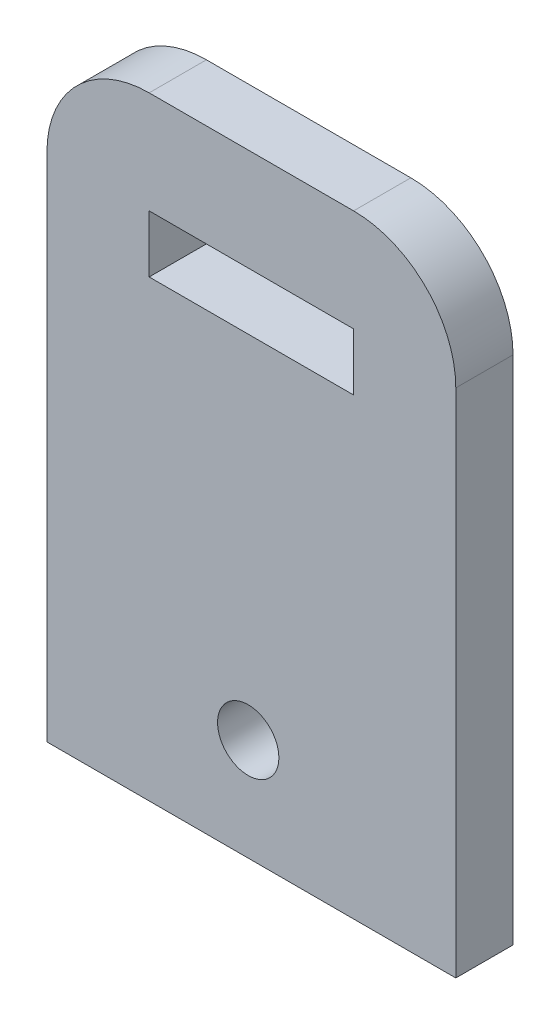
ISO-10303-21;
HEADER;
FILE_DESCRIPTION(('STEP AP214'),'2;1');
FILE_NAME('part.step','',(''),(''),'','','');
FILE_SCHEMA(('AUTOMOTIVE_DESIGN { 1 0 10303 214 1 1 1 1 }'));
ENDSEC;
DATA;
#1=APPLICATION_CONTEXT('core data for automotive mechanical design processes');
#2=APPLICATION_PROTOCOL_DEFINITION('international standard','automotive_design',2000,#1);
#3=PRODUCT_CONTEXT('',#1,'mechanical');
#4=PRODUCT('Part','Part','',(#3));
#5=PRODUCT_RELATED_PRODUCT_CATEGORY('part','',(#4));
#6=PRODUCT_DEFINITION_FORMATION('','',#4);
#7=PRODUCT_DEFINITION_CONTEXT('part definition',#1,'design');
#8=PRODUCT_DEFINITION('design','',#6,#7);
#9=PRODUCT_DEFINITION_SHAPE('','',#8);
#10=(LENGTH_UNIT() NAMED_UNIT(*) SI_UNIT(.MILLI.,.METRE.));
#11=(NAMED_UNIT(*) PLANE_ANGLE_UNIT() SI_UNIT($,.RADIAN.));
#12=(NAMED_UNIT(*) SI_UNIT($,.STERADIAN.) SOLID_ANGLE_UNIT());
#13=UNCERTAINTY_MEASURE_WITH_UNIT(LENGTH_MEASURE(1.E-05),#10,'distance_accuracy_value','');
#14=(GEOMETRIC_REPRESENTATION_CONTEXT(3) GLOBAL_UNCERTAINTY_ASSIGNED_CONTEXT((#13)) GLOBAL_UNIT_ASSIGNED_CONTEXT((#10,
#11,#12)) REPRESENTATION_CONTEXT('',''));
#15=CARTESIAN_POINT('',(0.,0.,0.));
#16=DIRECTION('',(0.,0.,1.));
#17=DIRECTION('',(1.,0.,0.));
#18=AXIS2_PLACEMENT_3D('',#15,#16,#17);
#19=CARTESIAN_POINT('',(96.8820478947637,12.5724817374954,2.8));
#20=DIRECTION('',(0.,0.,1.));
#21=DIRECTION('',(1.,0.,0.));
#22=AXIS2_PLACEMENT_3D('',#19,#20,#21);
#23=PLANE('',#22);
#24=DIRECTION('',(1.,0.,0.));
#25=VECTOR('',#24,1.);
#26=CARTESIAN_POINT('',(96.8820478947637,9.7724817374954,2.8));
#27=LINE('',#26,#25);
#28=CARTESIAN_POINT('',(96.8820478947637,9.7724817374954,2.8));
#29=VERTEX_POINT('',#28);
#30=CARTESIAN_POINT('',(106.882047894764,9.7724817374954,2.8));
#31=VERTEX_POINT('',#30);
#32=EDGE_CURVE('E118',#29,#31,#27,.T.);
#33=ORIENTED_EDGE('',*,*,#32,.F.);
#34=DIRECTION('',(0.,-1.,0.));
#35=VECTOR('',#34,1.);
#36=CARTESIAN_POINT('',(96.8820478947637,12.5724817374954,2.8));
#37=LINE('',#36,#35);
#38=CARTESIAN_POINT('',(96.8820478947637,12.5724817374954,2.8));
#39=VERTEX_POINT('',#38);
#40=EDGE_CURVE('E110',#39,#29,#37,.T.);
#41=ORIENTED_EDGE('',*,*,#40,.F.);
#42=DIRECTION('',(-1.,0.,0.));
#43=VECTOR('',#42,1.);
#44=CARTESIAN_POINT('',(106.882047894764,12.5724817374954,2.8));
#45=LINE('',#44,#43);
#46=CARTESIAN_POINT('',(106.882047894764,12.5724817374954,2.8));
#47=VERTEX_POINT('',#46);
#48=EDGE_CURVE('E133',#47,#39,#45,.T.);
#49=ORIENTED_EDGE('',*,*,#48,.F.);
#50=DIRECTION('',(0.,1.,0.));
#51=VECTOR('',#50,1.);
#52=CARTESIAN_POINT('',(106.882047894764,9.7724817374954,2.8));
#53=LINE('',#52,#51);
#54=EDGE_CURVE('E131',#31,#47,#53,.T.);
#55=ORIENTED_EDGE('',*,*,#54,.F.);
#56=EDGE_LOOP('',(#33,#41,#49,#55));
#57=FACE_BOUND('',#56,.T.);
#58=CARTESIAN_POINT('',(96.8820478947637,12.5724817374954,2.8));
#59=DIRECTION('',(0.,0.,1.));
#60=DIRECTION('',(1.,0.,0.));
#61=AXIS2_PLACEMENT_3D('',#58,#59,#60);
#62=CIRCLE('',#61,5.);
#63=CARTESIAN_POINT('',(96.8820478947637,17.5724817374954,2.8));
#64=VERTEX_POINT('',#63);
#65=CARTESIAN_POINT('',(91.8820478947637,12.5724817374954,2.8));
#66=VERTEX_POINT('',#65);
#67=EDGE_CURVE('E149',#64,#66,#62,.T.);
#68=ORIENTED_EDGE('',*,*,#67,.T.);
#69=DIRECTION('',(0.,-1.,0.));
#70=VECTOR('',#69,1.);
#71=CARTESIAN_POINT('',(91.8820478947637,12.5724817374954,2.8));
#72=LINE('',#71,#70);
#73=CARTESIAN_POINT('',(91.8820478947637,-12.4275182625046,2.8));
#74=VERTEX_POINT('',#73);
#75=EDGE_CURVE('E152',#66,#74,#72,.T.);
#76=ORIENTED_EDGE('',*,*,#75,.T.);
#77=DIRECTION('',(1.,0.,0.));
#78=VECTOR('',#77,1.);
#79=CARTESIAN_POINT('',(91.8820478947637,-12.4275182625046,2.8));
#80=LINE('',#79,#78);
#81=CARTESIAN_POINT('',(111.882047894764,-12.4275182625046,2.8));
#82=VERTEX_POINT('',#81);
#83=EDGE_CURVE('E155',#74,#82,#80,.T.);
#84=ORIENTED_EDGE('',*,*,#83,.T.);
#85=DIRECTION('',(0.,1.,0.));
#86=VECTOR('',#85,1.);
#87=CARTESIAN_POINT('',(111.882047894764,-12.4275182625046,2.8));
#88=LINE('',#87,#86);
#89=CARTESIAN_POINT('',(111.882047894764,12.5724817374954,2.8));
#90=VERTEX_POINT('',#89);
#91=EDGE_CURVE('E157',#82,#90,#88,.T.);
#92=ORIENTED_EDGE('',*,*,#91,.T.);
#93=CARTESIAN_POINT('',(106.882047894764,12.5724817374954,2.8));
#94=DIRECTION('',(0.,0.,1.));
#95=DIRECTION('',(1.,0.,0.));
#96=AXIS2_PLACEMENT_3D('',#93,#94,#95);
#97=CIRCLE('',#96,5.);
#98=CARTESIAN_POINT('',(106.882047894764,17.5724817374954,2.8));
#99=VERTEX_POINT('',#98);
#100=EDGE_CURVE('E159',#90,#99,#97,.T.);
#101=ORIENTED_EDGE('',*,*,#100,.T.);
#102=DIRECTION('',(-1.,0.,0.));
#103=VECTOR('',#102,1.);
#104=CARTESIAN_POINT('',(106.882047894764,17.5724817374954,2.8));
#105=LINE('',#104,#103);
#106=EDGE_CURVE('E161',#99,#64,#105,.T.);
#107=ORIENTED_EDGE('',*,*,#106,.T.);
#108=EDGE_LOOP('',(#68,#76,#84,#92,#101,#107));
#109=FACE_BOUND('',#108,.T.);
#110=CARTESIAN_POINT('',(101.727306447207,-7.4275182625046,2.8));
#111=DIRECTION('',(0.,0.,1.));
#112=DIRECTION('',(1.,0.,0.));
#113=AXIS2_PLACEMENT_3D('',#110,#111,#112);
#114=CIRCLE('',#113,1.5);
#115=CARTESIAN_POINT('',(103.227306447207,-7.4275182625046,2.8));
#116=VERTEX_POINT('',#115);
#117=EDGE_CURVE('E139',#116,#116,#114,.T.);
#118=ORIENTED_EDGE('',*,*,#117,.F.);
#119=EDGE_LOOP('',(#118));
#120=FACE_BOUND('',#119,.T.);
#121=ADVANCED_FACE('F33',(#57,#109,#120),#23,.T.);
#122=CARTESIAN_POINT('',(96.8820478947637,12.5724817374954,0.));
#123=DIRECTION('',(0.,0.,1.));
#124=DIRECTION('',(1.,0.,0.));
#125=AXIS2_PLACEMENT_3D('',#122,#123,#124);
#126=PLANE('',#125);
#127=CARTESIAN_POINT('',(96.8820478947637,12.5724817374954,0.));
#128=DIRECTION('',(0.,0.,1.));
#129=DIRECTION('',(1.,0.,0.));
#130=AXIS2_PLACEMENT_3D('',#127,#128,#129);
#131=CIRCLE('',#130,5.);
#132=CARTESIAN_POINT('',(96.8820478947637,17.5724817374954,0.));
#133=VERTEX_POINT('',#132);
#134=CARTESIAN_POINT('',(91.8820478947637,12.5724817374954,0.));
#135=VERTEX_POINT('',#134);
#136=EDGE_CURVE('E126',#133,#135,#131,.T.);
#137=ORIENTED_EDGE('',*,*,#136,.F.);
#138=DIRECTION('',(-1.,0.,0.));
#139=VECTOR('',#138,1.);
#140=CARTESIAN_POINT('',(106.882047894764,17.5724817374954,0.));
#141=LINE('',#140,#139);
#142=CARTESIAN_POINT('',(106.882047894764,17.5724817374954,0.));
#143=VERTEX_POINT('',#142);
#144=EDGE_CURVE('E153',#143,#133,#141,.T.);
#145=ORIENTED_EDGE('',*,*,#144,.F.);
#146=CARTESIAN_POINT('',(106.882047894764,12.5724817374954,0.));
#147=DIRECTION('',(0.,0.,1.));
#148=DIRECTION('',(1.,0.,0.));
#149=AXIS2_PLACEMENT_3D('',#146,#147,#148);
#150=CIRCLE('',#149,5.);
#151=CARTESIAN_POINT('',(111.882047894764,12.5724817374954,0.));
#152=VERTEX_POINT('',#151);
#153=EDGE_CURVE('E173',#152,#143,#150,.T.);
#154=ORIENTED_EDGE('',*,*,#153,.F.);
#155=DIRECTION('',(0.,1.,0.));
#156=VECTOR('',#155,1.);
#157=CARTESIAN_POINT('',(111.882047894764,-2.4275182625046,0.));
#158=LINE('',#157,#156);
#159=CARTESIAN_POINT('',(111.882047894764,-12.4275182625046,0.));
#160=VERTEX_POINT('',#159);
#161=EDGE_CURVE('E171',#160,#152,#158,.T.);
#162=ORIENTED_EDGE('',*,*,#161,.F.);
#163=DIRECTION('',(1.,0.,0.));
#164=VECTOR('',#163,1.);
#165=CARTESIAN_POINT('',(91.8820478947637,-12.4275182625046,0.));
#166=LINE('',#165,#164);
#167=CARTESIAN_POINT('',(91.8820478947637,-12.4275182625046,0.));
#168=VERTEX_POINT('',#167);
#169=EDGE_CURVE('E168',#168,#160,#166,.T.);
#170=ORIENTED_EDGE('',*,*,#169,.F.);
#171=DIRECTION('',(0.,-1.,0.));
#172=VECTOR('',#171,1.);
#173=CARTESIAN_POINT('',(91.8820478947637,-12.4275182625046,0.));
#174=LINE('',#173,#172);
#175=EDGE_CURVE('E166',#135,#168,#174,.T.);
#176=ORIENTED_EDGE('',*,*,#175,.F.);
#177=EDGE_LOOP('',(#137,#145,#154,#162,#170,#176));
#178=FACE_BOUND('',#177,.T.);
#179=DIRECTION('',(0.,-1.,0.));
#180=VECTOR('',#179,1.);
#181=CARTESIAN_POINT('',(96.8820478947637,12.5724817374954,0.));
#182=LINE('',#181,#180);
#183=CARTESIAN_POINT('',(96.8820478947637,12.5724817374954,0.));
#184=VERTEX_POINT('',#183);
#185=CARTESIAN_POINT('',(96.8820478947637,9.7724817374954,0.));
#186=VERTEX_POINT('',#185);
#187=EDGE_CURVE('E56',#184,#186,#182,.T.);
#188=ORIENTED_EDGE('',*,*,#187,.T.);
#189=DIRECTION('',(1.,0.,0.));
#190=VECTOR('',#189,1.);
#191=CARTESIAN_POINT('',(96.8820478947637,9.7724817374954,0.));
#192=LINE('',#191,#190);
#193=CARTESIAN_POINT('',(106.882047894764,9.7724817374954,0.));
#194=VERTEX_POINT('',#193);
#195=EDGE_CURVE('E125',#186,#194,#192,.T.);
#196=ORIENTED_EDGE('',*,*,#195,.T.);
#197=DIRECTION('',(0.,1.,0.));
#198=VECTOR('',#197,1.);
#199=CARTESIAN_POINT('',(106.882047894764,9.7724817374954,0.));
#200=LINE('',#199,#198);
#201=CARTESIAN_POINT('',(106.882047894764,12.5724817374954,0.));
#202=VERTEX_POINT('',#201);
#203=EDGE_CURVE('E141',#194,#202,#200,.T.);
#204=ORIENTED_EDGE('',*,*,#203,.T.);
#205=DIRECTION('',(-1.,0.,0.));
#206=VECTOR('',#205,1.);
#207=CARTESIAN_POINT('',(101.882047894764,12.5724817374954,0.));
#208=LINE('',#207,#206);
#209=EDGE_CURVE('E119',#202,#184,#208,.T.);
#210=ORIENTED_EDGE('',*,*,#209,.T.);
#211=EDGE_LOOP('',(#188,#196,#204,#210));
#212=FACE_BOUND('',#211,.T.);
#213=CARTESIAN_POINT('',(101.727306447207,-7.4275182625046,0.));
#214=DIRECTION('',(0.,0.,1.));
#215=DIRECTION('',(1.,0.,0.));
#216=AXIS2_PLACEMENT_3D('',#213,#214,#215);
#217=CIRCLE('',#216,1.5);
#218=CARTESIAN_POINT('',(103.227306447207,-7.4275182625046,0.));
#219=VERTEX_POINT('',#218);
#220=EDGE_CURVE('E251',#219,#219,#217,.T.);
#221=ORIENTED_EDGE('',*,*,#220,.T.);
#222=EDGE_LOOP('',(#221));
#223=FACE_BOUND('',#222,.T.);
#224=ADVANCED_FACE('F196',(#178,#212,#223),#126,.F.);
#225=CARTESIAN_POINT('',(96.8820478947637,12.5724817374954,2.8));
#226=DIRECTION('',(0.,0.,-1.));
#227=DIRECTION('',(-1.,0.,0.));
#228=AXIS2_PLACEMENT_3D('',#225,#226,#227);
#229=CYLINDRICAL_SURFACE('',#228,5.);
#230=ORIENTED_EDGE('',*,*,#136,.T.);
#231=DIRECTION('',(0.,0.,-1.));
#232=VECTOR('',#231,1.);
#233=CARTESIAN_POINT('',(91.8820478947637,12.5724817374954,2.8));
#234=LINE('',#233,#232);
#235=EDGE_CURVE('E11',#66,#135,#234,.T.);
#236=ORIENTED_EDGE('',*,*,#235,.F.);
#237=ORIENTED_EDGE('',*,*,#67,.F.);
#238=DIRECTION('',(0.,0.,-1.));
#239=VECTOR('',#238,1.);
#240=CARTESIAN_POINT('',(96.8820478947637,17.5724817374954,2.8));
#241=LINE('',#240,#239);
#242=EDGE_CURVE('E163',#64,#133,#241,.T.);
#243=ORIENTED_EDGE('',*,*,#242,.T.);
#244=EDGE_LOOP('',(#230,#236,#237,#243));
#245=FACE_BOUND('',#244,.T.);
#246=ADVANCED_FACE('F35',(#245),#229,.T.);
#247=CARTESIAN_POINT('',(91.8820478947637,-12.4275182625046,2.8));
#248=DIRECTION('',(1.,0.,0.));
#249=DIRECTION('',(0.,0.,-1.));
#250=AXIS2_PLACEMENT_3D('',#247,#248,#249);
#251=PLANE('',#250);
#252=ORIENTED_EDGE('',*,*,#175,.T.);
#253=DIRECTION('',(0.,0.,-1.));
#254=VECTOR('',#253,1.);
#255=CARTESIAN_POINT('',(91.8820478947637,-12.4275182625046,2.8));
#256=LINE('',#255,#254);
#257=EDGE_CURVE('E41',#74,#168,#256,.T.);
#258=ORIENTED_EDGE('',*,*,#257,.F.);
#259=ORIENTED_EDGE('',*,*,#75,.F.);
#260=ORIENTED_EDGE('',*,*,#235,.T.);
#261=EDGE_LOOP('',(#252,#258,#259,#260));
#262=FACE_BOUND('',#261,.T.);
#263=ADVANCED_FACE('F213',(#262),#251,.F.);
#264=CARTESIAN_POINT('',(91.8820478947637,-12.4275182625046,2.8));
#265=DIRECTION('',(0.,1.,0.));
#266=DIRECTION('',(0.,0.,1.));
#267=AXIS2_PLACEMENT_3D('',#264,#265,#266);
#268=PLANE('',#267);
#269=ORIENTED_EDGE('',*,*,#169,.T.);
#270=DIRECTION('',(0.,0.,-1.));
#271=VECTOR('',#270,1.);
#272=CARTESIAN_POINT('',(111.882047894764,-12.4275182625046,2.8));
#273=LINE('',#272,#271);
#274=EDGE_CURVE('E184',#82,#160,#273,.T.);
#275=ORIENTED_EDGE('',*,*,#274,.F.);
#276=ORIENTED_EDGE('',*,*,#83,.F.);
#277=ORIENTED_EDGE('',*,*,#257,.T.);
#278=EDGE_LOOP('',(#269,#275,#276,#277));
#279=FACE_BOUND('',#278,.T.);
#280=ADVANCED_FACE('F191',(#279),#268,.F.);
#281=CARTESIAN_POINT('',(111.882047894764,-2.4275182625046,2.8));
#282=DIRECTION('',(-1.,0.,0.));
#283=DIRECTION('',(0.,0.,1.));
#284=AXIS2_PLACEMENT_3D('',#281,#282,#283);
#285=PLANE('',#284);
#286=ORIENTED_EDGE('',*,*,#161,.T.);
#287=DIRECTION('',(0.,0.,-1.));
#288=VECTOR('',#287,1.);
#289=CARTESIAN_POINT('',(111.882047894764,12.5724817374954,2.8));
#290=LINE('',#289,#288);
#291=EDGE_CURVE('E181',#90,#152,#290,.T.);
#292=ORIENTED_EDGE('',*,*,#291,.F.);
#293=ORIENTED_EDGE('',*,*,#91,.F.);
#294=ORIENTED_EDGE('',*,*,#274,.T.);
#295=EDGE_LOOP('',(#286,#292,#293,#294));
#296=FACE_BOUND('',#295,.T.);
#297=ADVANCED_FACE('F202',(#296),#285,.F.);
#298=CARTESIAN_POINT('',(106.882047894764,12.5724817374954,2.8));
#299=DIRECTION('',(0.,0.,-1.));
#300=DIRECTION('',(-1.,0.,0.));
#301=AXIS2_PLACEMENT_3D('',#298,#299,#300);
#302=CYLINDRICAL_SURFACE('',#301,5.);
#303=ORIENTED_EDGE('',*,*,#153,.T.);
#304=DIRECTION('',(0.,0.,-1.));
#305=VECTOR('',#304,1.);
#306=CARTESIAN_POINT('',(106.882047894764,17.5724817374954,2.8));
#307=LINE('',#306,#305);
#308=EDGE_CURVE('E178',#99,#143,#307,.T.);
#309=ORIENTED_EDGE('',*,*,#308,.F.);
#310=ORIENTED_EDGE('',*,*,#100,.F.);
#311=ORIENTED_EDGE('',*,*,#291,.T.);
#312=EDGE_LOOP('',(#303,#309,#310,#311));
#313=FACE_BOUND('',#312,.T.);
#314=ADVANCED_FACE('F206',(#313),#302,.T.);
#315=CARTESIAN_POINT('',(106.882047894764,17.5724817374954,2.8));
#316=DIRECTION('',(0.,-1.,0.));
#317=DIRECTION('',(0.,0.,-1.));
#318=AXIS2_PLACEMENT_3D('',#315,#316,#317);
#319=PLANE('',#318);
#320=ORIENTED_EDGE('',*,*,#144,.T.);
#321=ORIENTED_EDGE('',*,*,#242,.F.);
#322=ORIENTED_EDGE('',*,*,#106,.F.);
#323=ORIENTED_EDGE('',*,*,#308,.T.);
#324=EDGE_LOOP('',(#320,#321,#322,#323));
#325=FACE_BOUND('',#324,.T.);
#326=ADVANCED_FACE('F216',(#325),#319,.F.);
#327=CARTESIAN_POINT('',(96.8820478947637,12.5724817374954,2.8));
#328=DIRECTION('',(1.,0.,0.));
#329=DIRECTION('',(0.,0.,-1.));
#330=AXIS2_PLACEMENT_3D('',#327,#328,#329);
#331=PLANE('',#330);
#332=ORIENTED_EDGE('',*,*,#187,.F.);
#333=DIRECTION('',(0.,0.,-1.));
#334=VECTOR('',#333,1.);
#335=CARTESIAN_POINT('',(96.8820478947637,12.5724817374954,2.8));
#336=LINE('',#335,#334);
#337=EDGE_CURVE('E114',#39,#184,#336,.T.);
#338=ORIENTED_EDGE('',*,*,#337,.F.);
#339=ORIENTED_EDGE('',*,*,#40,.T.);
#340=DIRECTION('',(0.,0.,-1.));
#341=VECTOR('',#340,1.);
#342=CARTESIAN_POINT('',(96.8820478947637,9.7724817374954,2.8));
#343=LINE('',#342,#341);
#344=EDGE_CURVE('E113',#29,#186,#343,.T.);
#345=ORIENTED_EDGE('',*,*,#344,.T.);
#346=EDGE_LOOP('',(#332,#338,#339,#345));
#347=FACE_BOUND('',#346,.T.);
#348=ADVANCED_FACE('F112',(#347),#331,.T.);
#349=CARTESIAN_POINT('',(96.8820478947637,9.7724817374954,2.8));
#350=DIRECTION('',(0.,1.,0.));
#351=DIRECTION('',(0.,0.,1.));
#352=AXIS2_PLACEMENT_3D('',#349,#350,#351);
#353=PLANE('',#352);
#354=ORIENTED_EDGE('',*,*,#195,.F.);
#355=ORIENTED_EDGE('',*,*,#344,.F.);
#356=ORIENTED_EDGE('',*,*,#32,.T.);
#357=DIRECTION('',(0.,0.,-1.));
#358=VECTOR('',#357,1.);
#359=CARTESIAN_POINT('',(106.882047894764,9.7724817374954,2.8));
#360=LINE('',#359,#358);
#361=EDGE_CURVE('E127',#31,#194,#360,.T.);
#362=ORIENTED_EDGE('',*,*,#361,.T.);
#363=EDGE_LOOP('',(#354,#355,#356,#362));
#364=FACE_BOUND('',#363,.T.);
#365=ADVANCED_FACE('F122',(#364),#353,.T.);
#366=CARTESIAN_POINT('',(106.882047894764,9.7724817374954,2.8));
#367=DIRECTION('',(-1.,0.,0.));
#368=DIRECTION('',(0.,0.,1.));
#369=AXIS2_PLACEMENT_3D('',#366,#367,#368);
#370=PLANE('',#369);
#371=ORIENTED_EDGE('',*,*,#203,.F.);
#372=ORIENTED_EDGE('',*,*,#361,.F.);
#373=ORIENTED_EDGE('',*,*,#54,.T.);
#374=DIRECTION('',(0.,0.,-1.));
#375=VECTOR('',#374,1.);
#376=CARTESIAN_POINT('',(106.882047894764,12.5724817374954,2.8));
#377=LINE('',#376,#375);
#378=EDGE_CURVE('E48',#47,#202,#377,.T.);
#379=ORIENTED_EDGE('',*,*,#378,.T.);
#380=EDGE_LOOP('',(#371,#372,#373,#379));
#381=FACE_BOUND('',#380,.T.);
#382=ADVANCED_FACE('F234',(#381),#370,.T.);
#383=CARTESIAN_POINT('',(101.882047894764,12.5724817374954,2.8));
#384=DIRECTION('',(0.,-1.,0.));
#385=DIRECTION('',(0.,0.,-1.));
#386=AXIS2_PLACEMENT_3D('',#383,#384,#385);
#387=PLANE('',#386);
#388=ORIENTED_EDGE('',*,*,#209,.F.);
#389=ORIENTED_EDGE('',*,*,#378,.F.);
#390=ORIENTED_EDGE('',*,*,#48,.T.);
#391=ORIENTED_EDGE('',*,*,#337,.T.);
#392=EDGE_LOOP('',(#388,#389,#390,#391));
#393=FACE_BOUND('',#392,.T.);
#394=ADVANCED_FACE('F237',(#393),#387,.T.);
#395=CARTESIAN_POINT('',(101.727306447207,-7.4275182625046,2.8));
#396=DIRECTION('',(0.,0.,-1.));
#397=DIRECTION('',(-1.,0.,0.));
#398=AXIS2_PLACEMENT_3D('',#395,#396,#397);
#399=CYLINDRICAL_SURFACE('',#398,1.5);
#400=ORIENTED_EDGE('',*,*,#117,.T.);
#401=EDGE_LOOP('',(#400));
#402=FACE_BOUND('',#401,.T.);
#403=ORIENTED_EDGE('',*,*,#220,.F.);
#404=EDGE_LOOP('',(#403));
#405=FACE_BOUND('',#404,.T.);
#406=ADVANCED_FACE('F241',(#402,#405),#399,.F.);
#407=CLOSED_SHELL('',(#121,#224,#246,#263,#280,#297,#314,#326,#348,#365,#382,#394,#406));
#408=MANIFOLD_SOLID_BREP('B2',#407);
#409=ADVANCED_BREP_SHAPE_REPRESENTATION('',(#18,#408),#14);
#410=SHAPE_DEFINITION_REPRESENTATION(#9,#409);
ENDSEC;
END-ISO-10303-21;
